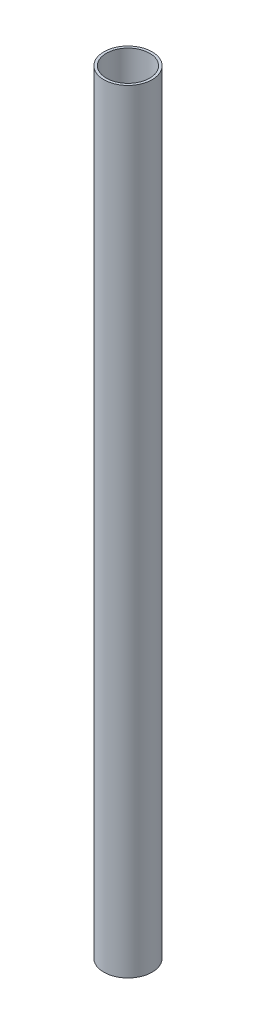
ISO-10303-21;
HEADER;
FILE_DESCRIPTION(('STEP AP214'),'2;1');
FILE_NAME('part.step','',(''),(''),'','','');
FILE_SCHEMA(('AUTOMOTIVE_DESIGN { 1 0 10303 214 1 1 1 1 }'));
ENDSEC;
DATA;
#1=APPLICATION_CONTEXT('core data for automotive mechanical design processes');
#2=APPLICATION_PROTOCOL_DEFINITION('international standard','automotive_design',2000,#1);
#3=PRODUCT_CONTEXT('',#1,'mechanical');
#4=PRODUCT('Part','Part','',(#3));
#5=PRODUCT_RELATED_PRODUCT_CATEGORY('part','',(#4));
#6=PRODUCT_DEFINITION_FORMATION('','',#4);
#7=PRODUCT_DEFINITION_CONTEXT('part definition',#1,'design');
#8=PRODUCT_DEFINITION('design','',#6,#7);
#9=PRODUCT_DEFINITION_SHAPE('','',#8);
#10=(LENGTH_UNIT() NAMED_UNIT(*) SI_UNIT(.MILLI.,.METRE.));
#11=(NAMED_UNIT(*) PLANE_ANGLE_UNIT() SI_UNIT($,.RADIAN.));
#12=(NAMED_UNIT(*) SI_UNIT($,.STERADIAN.) SOLID_ANGLE_UNIT());
#13=UNCERTAINTY_MEASURE_WITH_UNIT(LENGTH_MEASURE(1.E-05),#10,'distance_accuracy_value','');
#14=(GEOMETRIC_REPRESENTATION_CONTEXT(3) GLOBAL_UNCERTAINTY_ASSIGNED_CONTEXT((#13)) GLOBAL_UNIT_ASSIGNED_CONTEXT((#10,
#11,#12)) REPRESENTATION_CONTEXT('',''));
#15=CARTESIAN_POINT('',(0.,0.,0.));
#16=DIRECTION('',(0.,0.,1.));
#17=DIRECTION('',(1.,0.,0.));
#18=AXIS2_PLACEMENT_3D('',#15,#16,#17);
#19=CARTESIAN_POINT('',(0.,508.,0.));
#20=DIRECTION('',(0.,-1.,0.));
#21=DIRECTION('',(0.,0.,-1.));
#22=AXIS2_PLACEMENT_3D('',#19,#20,#21);
#23=CYLINDRICAL_SURFACE('',#22,14.224);
#24=CARTESIAN_POINT('',(0.,508.,0.));
#25=DIRECTION('',(0.,1.,0.));
#26=DIRECTION('',(0.,0.,1.));
#27=AXIS2_PLACEMENT_3D('',#24,#25,#26);
#28=CIRCLE('',#27,14.224);
#29=CARTESIAN_POINT('',(0.,508.,14.224));
#30=VERTEX_POINT('',#29);
#31=EDGE_CURVE('E58',#30,#30,#28,.T.);
#32=ORIENTED_EDGE('',*,*,#31,.T.);
#33=EDGE_LOOP('',(#32));
#34=FACE_BOUND('',#33,.T.);
#35=CARTESIAN_POINT('',(0.,0.,0.));
#36=DIRECTION('',(0.,1.,0.));
#37=DIRECTION('',(0.,0.,1.));
#38=AXIS2_PLACEMENT_3D('',#35,#36,#37);
#39=CIRCLE('',#38,14.224);
#40=CARTESIAN_POINT('',(0.,0.,14.224));
#41=VERTEX_POINT('',#40);
#42=EDGE_CURVE('E65',#41,#41,#39,.T.);
#43=ORIENTED_EDGE('',*,*,#42,.F.);
#44=EDGE_LOOP('',(#43));
#45=FACE_BOUND('',#44,.T.);
#46=ADVANCED_FACE('F50',(#34,#45),#23,.F.);
#47=CARTESIAN_POINT('',(0.,508.,0.));
#48=DIRECTION('',(0.,-1.,0.));
#49=DIRECTION('',(0.,0.,-1.));
#50=AXIS2_PLACEMENT_3D('',#47,#48,#49);
#51=CYLINDRICAL_SURFACE('',#50,15.875);
#52=CARTESIAN_POINT('',(0.,508.,0.));
#53=DIRECTION('',(0.,1.,0.));
#54=DIRECTION('',(0.,0.,1.));
#55=AXIS2_PLACEMENT_3D('',#52,#53,#54);
#56=CIRCLE('',#55,15.875);
#57=CARTESIAN_POINT('',(0.,508.,15.875));
#58=VERTEX_POINT('',#57);
#59=EDGE_CURVE('E11',#58,#58,#56,.T.);
#60=ORIENTED_EDGE('',*,*,#59,.F.);
#61=EDGE_LOOP('',(#60));
#62=FACE_BOUND('',#61,.T.);
#63=CARTESIAN_POINT('',(0.,0.,0.));
#64=DIRECTION('',(0.,1.,0.));
#65=DIRECTION('',(0.,0.,1.));
#66=AXIS2_PLACEMENT_3D('',#63,#64,#65);
#67=CIRCLE('',#66,15.875);
#68=CARTESIAN_POINT('',(0.,0.,15.875));
#69=VERTEX_POINT('',#68);
#70=EDGE_CURVE('E53',#69,#69,#67,.T.);
#71=ORIENTED_EDGE('',*,*,#70,.T.);
#72=EDGE_LOOP('',(#71));
#73=FACE_BOUND('',#72,.T.);
#74=ADVANCED_FACE('F74',(#62,#73),#51,.T.);
#75=CARTESIAN_POINT('',(0.,508.,0.));
#76=DIRECTION('',(0.,1.,0.));
#77=DIRECTION('',(0.,0.,1.));
#78=AXIS2_PLACEMENT_3D('',#75,#76,#77);
#79=PLANE('',#78);
#80=ORIENTED_EDGE('',*,*,#31,.F.);
#81=EDGE_LOOP('',(#80));
#82=FACE_BOUND('',#81,.T.);
#83=ORIENTED_EDGE('',*,*,#59,.T.);
#84=EDGE_LOOP('',(#83));
#85=FACE_BOUND('',#84,.T.);
#86=ADVANCED_FACE('F78',(#82,#85),#79,.T.);
#87=CARTESIAN_POINT('',(0.,0.,0.));
#88=DIRECTION('',(0.,1.,0.));
#89=DIRECTION('',(0.,0.,1.));
#90=AXIS2_PLACEMENT_3D('',#87,#88,#89);
#91=PLANE('',#90);
#92=ORIENTED_EDGE('',*,*,#42,.T.);
#93=EDGE_LOOP('',(#92));
#94=FACE_BOUND('',#93,.T.);
#95=ORIENTED_EDGE('',*,*,#70,.F.);
#96=EDGE_LOOP('',(#95));
#97=FACE_BOUND('',#96,.T.);
#98=ADVANCED_FACE('F76',(#94,#97),#91,.F.);
#99=CLOSED_SHELL('',(#46,#74,#86,#98));
#100=MANIFOLD_SOLID_BREP('B2',#99);
#101=ADVANCED_BREP_SHAPE_REPRESENTATION('',(#18,#100),#14);
#102=SHAPE_DEFINITION_REPRESENTATION(#9,#101);
ENDSEC;
END-ISO-10303-21;
